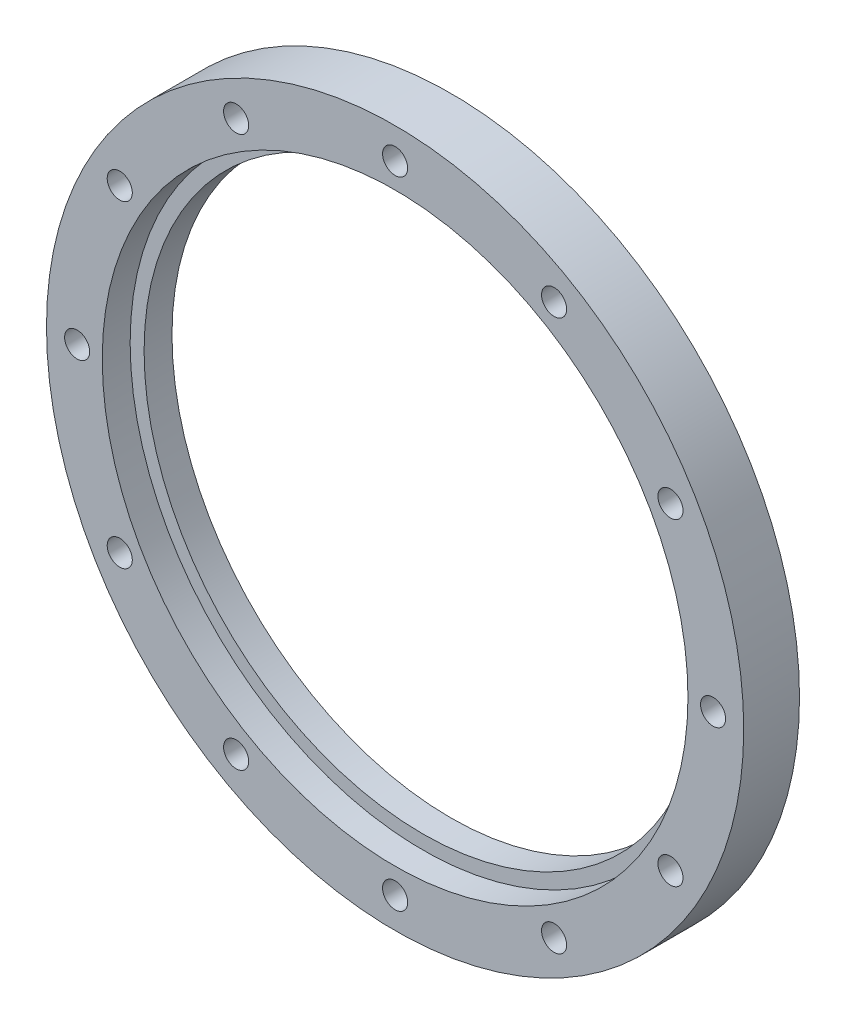
ISO-10303-21;
HEADER;
FILE_DESCRIPTION(('STEP AP214'),'2;1');
FILE_NAME('part.step','',(''),(''),'','','');
FILE_SCHEMA(('AUTOMOTIVE_DESIGN { 1 0 10303 214 1 1 1 1 }'));
ENDSEC;
DATA;
#1=APPLICATION_CONTEXT('core data for automotive mechanical design processes');
#2=APPLICATION_PROTOCOL_DEFINITION('international standard','automotive_design',2000,#1);
#3=PRODUCT_CONTEXT('',#1,'mechanical');
#4=PRODUCT('Part','Part','',(#3));
#5=PRODUCT_RELATED_PRODUCT_CATEGORY('part','',(#4));
#6=PRODUCT_DEFINITION_FORMATION('','',#4);
#7=PRODUCT_DEFINITION_CONTEXT('part definition',#1,'design');
#8=PRODUCT_DEFINITION('design','',#6,#7);
#9=PRODUCT_DEFINITION_SHAPE('','',#8);
#10=(LENGTH_UNIT() NAMED_UNIT(*) SI_UNIT(.MILLI.,.METRE.));
#11=(NAMED_UNIT(*) PLANE_ANGLE_UNIT() SI_UNIT($,.RADIAN.));
#12=(NAMED_UNIT(*) SI_UNIT($,.STERADIAN.) SOLID_ANGLE_UNIT());
#13=UNCERTAINTY_MEASURE_WITH_UNIT(LENGTH_MEASURE(1.E-05),#10,'distance_accuracy_value','');
#14=(GEOMETRIC_REPRESENTATION_CONTEXT(3) GLOBAL_UNCERTAINTY_ASSIGNED_CONTEXT((#13)) GLOBAL_UNIT_ASSIGNED_CONTEXT((#10,
#11,#12)) REPRESENTATION_CONTEXT('',''));
#15=CARTESIAN_POINT('',(0.,0.,0.));
#16=DIRECTION('',(0.,0.,1.));
#17=DIRECTION('',(1.,0.,0.));
#18=AXIS2_PLACEMENT_3D('',#15,#16,#17);
#19=CARTESIAN_POINT('',(0.,0.,0.));
#20=DIRECTION('',(0.,0.,1.));
#21=DIRECTION('',(1.,0.,0.));
#22=AXIS2_PLACEMENT_3D('',#19,#20,#21);
#23=PLANE('',#22);
#24=CARTESIAN_POINT('',(49.3634480157127,28.5000000000006,0.));
#25=DIRECTION('',(0.,0.,-1.));
#26=DIRECTION('',(-1.,0.,0.));
#27=AXIS2_PLACEMENT_3D('',#24,#25,#26);
#28=CIRCLE('',#27,5.);
#29=CARTESIAN_POINT('',(44.3634480157127,28.5000000000006,0.));
#30=VERTEX_POINT('',#29);
#31=EDGE_CURVE('E185',#30,#30,#28,.T.);
#32=ORIENTED_EDGE('',*,*,#31,.F.);
#33=EDGE_LOOP('',(#32));
#34=FACE_BOUND('',#33,.T.);
#35=CARTESIAN_POINT('',(57.,5.97043308942176E-13,0.));
#36=DIRECTION('',(0.,0.,-1.));
#37=DIRECTION('',(-1.,0.,0.));
#38=AXIS2_PLACEMENT_3D('',#35,#36,#37);
#39=CIRCLE('',#38,5.);
#40=CARTESIAN_POINT('',(52.,5.97043308942176E-13,0.));
#41=VERTEX_POINT('',#40);
#42=EDGE_CURVE('E173',#41,#41,#39,.T.);
#43=ORIENTED_EDGE('',*,*,#42,.F.);
#44=EDGE_LOOP('',(#43));
#45=FACE_BOUND('',#44,.T.);
#46=CARTESIAN_POINT('',(49.3634480157133,-28.4999999999995,0.));
#47=DIRECTION('',(0.,0.,-1.));
#48=DIRECTION('',(-1.,0.,0.));
#49=AXIS2_PLACEMENT_3D('',#46,#47,#48);
#50=CIRCLE('',#49,5.);
#51=CARTESIAN_POINT('',(44.3634480157133,-28.4999999999995,0.));
#52=VERTEX_POINT('',#51);
#53=EDGE_CURVE('E161',#52,#52,#50,.T.);
#54=ORIENTED_EDGE('',*,*,#53,.F.);
#55=EDGE_LOOP('',(#54));
#56=FACE_BOUND('',#55,.T.);
#57=CARTESIAN_POINT('',(28.5000000000004,-49.3634480157128,0.));
#58=DIRECTION('',(0.,0.,-1.));
#59=DIRECTION('',(-1.,0.,0.));
#60=AXIS2_PLACEMENT_3D('',#57,#58,#59);
#61=CIRCLE('',#60,5.);
#62=CARTESIAN_POINT('',(23.5000000000004,-49.3634480157128,0.));
#63=VERTEX_POINT('',#62);
#64=EDGE_CURVE('E149',#63,#63,#61,.T.);
#65=ORIENTED_EDGE('',*,*,#64,.F.);
#66=EDGE_LOOP('',(#65));
#67=FACE_BOUND('',#66,.T.);
#68=CARTESIAN_POINT('',(-28.4999999999997,-49.3634480157132,0.));
#69=DIRECTION('',(0.,0.,-1.));
#70=DIRECTION('',(-1.,0.,0.));
#71=AXIS2_PLACEMENT_3D('',#68,#69,#70);
#72=CIRCLE('',#71,5.);
#73=CARTESIAN_POINT('',(-33.4999999999997,-49.3634480157132,0.));
#74=VERTEX_POINT('',#73);
#75=EDGE_CURVE('E125',#74,#74,#72,.T.);
#76=ORIENTED_EDGE('',*,*,#75,.F.);
#77=EDGE_LOOP('',(#76));
#78=FACE_BOUND('',#77,.T.);
#79=CARTESIAN_POINT('',(-49.3634480157129,-28.5000000000002,0.));
#80=DIRECTION('',(0.,0.,-1.));
#81=DIRECTION('',(-1.,0.,0.));
#82=AXIS2_PLACEMENT_3D('',#79,#80,#81);
#83=CIRCLE('',#82,5.);
#84=CARTESIAN_POINT('',(-54.3634480157129,-28.5000000000002,0.));
#85=VERTEX_POINT('',#84);
#86=EDGE_CURVE('E113',#85,#85,#83,.T.);
#87=ORIENTED_EDGE('',*,*,#86,.F.);
#88=EDGE_LOOP('',(#87));
#89=FACE_BOUND('',#88,.T.);
#90=CARTESIAN_POINT('',(-57.,-1.99014436314059E-13,0.));
#91=DIRECTION('',(0.,0.,-1.));
#92=DIRECTION('',(-1.,0.,0.));
#93=AXIS2_PLACEMENT_3D('',#90,#91,#92);
#94=CIRCLE('',#93,5.);
#95=CARTESIAN_POINT('',(-62.,-1.99014436314059E-13,0.));
#96=VERTEX_POINT('',#95);
#97=EDGE_CURVE('E101',#96,#96,#94,.T.);
#98=ORIENTED_EDGE('',*,*,#97,.F.);
#99=EDGE_LOOP('',(#98));
#100=FACE_BOUND('',#99,.T.);
#101=CARTESIAN_POINT('',(-49.3634480157131,28.4999999999999,0.));
#102=DIRECTION('',(0.,0.,-1.));
#103=DIRECTION('',(-1.,0.,0.));
#104=AXIS2_PLACEMENT_3D('',#101,#102,#103);
#105=CIRCLE('',#104,5.);
#106=CARTESIAN_POINT('',(-54.3634480157131,28.4999999999999,0.));
#107=VERTEX_POINT('',#106);
#108=EDGE_CURVE('E89',#107,#107,#105,.T.);
#109=ORIENTED_EDGE('',*,*,#108,.F.);
#110=EDGE_LOOP('',(#109));
#111=FACE_BOUND('',#110,.T.);
#112=CARTESIAN_POINT('',(-28.5000000000001,49.363448015713,0.));
#113=DIRECTION('',(0.,0.,-1.));
#114=DIRECTION('',(-1.,0.,0.));
#115=AXIS2_PLACEMENT_3D('',#112,#113,#114);
#116=CIRCLE('',#115,5.);
#117=CARTESIAN_POINT('',(-33.5000000000001,49.363448015713,0.));
#118=VERTEX_POINT('',#117);
#119=EDGE_CURVE('E77',#118,#118,#116,.T.);
#120=ORIENTED_EDGE('',*,*,#119,.F.);
#121=EDGE_LOOP('',(#120));
#122=FACE_BOUND('',#121,.T.);
#123=CARTESIAN_POINT('',(0.,57.,0.));
#124=DIRECTION('',(0.,0.,-1.));
#125=DIRECTION('',(-1.,0.,0.));
#126=AXIS2_PLACEMENT_3D('',#123,#124,#125);
#127=CIRCLE('',#126,5.);
#128=CARTESIAN_POINT('',(-5.,57.,0.));
#129=VERTEX_POINT('',#128);
#130=EDGE_CURVE('E65',#129,#129,#127,.T.);
#131=ORIENTED_EDGE('',*,*,#130,.F.);
#132=EDGE_LOOP('',(#131));
#133=FACE_BOUND('',#132,.T.);
#134=CARTESIAN_POINT('',(0.,0.,0.));
#135=DIRECTION('',(0.,0.,1.));
#136=DIRECTION('',(1.,0.,0.));
#137=AXIS2_PLACEMENT_3D('',#134,#135,#136);
#138=CIRCLE('',#137,50.);
#139=CARTESIAN_POINT('',(50.,0.,0.));
#140=VERTEX_POINT('',#139);
#141=EDGE_CURVE('E46',#140,#140,#138,.T.);
#142=ORIENTED_EDGE('',*,*,#141,.T.);
#143=EDGE_LOOP('',(#142));
#144=FACE_BOUND('',#143,.T.);
#145=CARTESIAN_POINT('',(0.,0.,0.));
#146=DIRECTION('',(0.,0.,1.));
#147=DIRECTION('',(1.,0.,0.));
#148=AXIS2_PLACEMENT_3D('',#145,#146,#147);
#149=CIRCLE('',#148,62.5);
#150=CARTESIAN_POINT('',(62.5,0.,0.));
#151=VERTEX_POINT('',#150);
#152=EDGE_CURVE('E41',#151,#151,#149,.T.);
#153=ORIENTED_EDGE('',*,*,#152,.F.);
#154=EDGE_LOOP('',(#153));
#155=FACE_BOUND('',#154,.T.);
#156=CARTESIAN_POINT('',(0.,-57.,0.));
#157=DIRECTION('',(0.,0.,-1.));
#158=DIRECTION('',(-1.,0.,0.));
#159=AXIS2_PLACEMENT_3D('',#156,#157,#158);
#160=CIRCLE('',#159,5.);
#161=CARTESIAN_POINT('',(-5.,-57.,0.));
#162=VERTEX_POINT('',#161);
#163=EDGE_CURVE('E137',#162,#162,#160,.T.);
#164=ORIENTED_EDGE('',*,*,#163,.F.);
#165=EDGE_LOOP('',(#164));
#166=FACE_BOUND('',#165,.T.);
#167=CARTESIAN_POINT('',(28.4999999999994,49.3634480157134,0.));
#168=DIRECTION('',(0.,0.,-1.));
#169=DIRECTION('',(-1.,0.,0.));
#170=AXIS2_PLACEMENT_3D('',#167,#168,#169);
#171=CIRCLE('',#170,5.);
#172=CARTESIAN_POINT('',(23.4999999999994,49.3634480157134,0.));
#173=VERTEX_POINT('',#172);
#174=EDGE_CURVE('E197',#173,#173,#171,.T.);
#175=ORIENTED_EDGE('',*,*,#174,.F.);
#176=EDGE_LOOP('',(#175));
#177=FACE_BOUND('',#176,.T.);
#178=ADVANCED_FACE('F33',(#34,#45,#56,#67,#78,#89,#100,#111,#122,#133,#144,#155,#166,#177),#23,.F.);
#179=CARTESIAN_POINT('',(0.,0.,10.));
#180=DIRECTION('',(0.,0.,1.));
#181=DIRECTION('',(1.,0.,0.));
#182=AXIS2_PLACEMENT_3D('',#179,#180,#181);
#183=PLANE('',#182);
#184=CARTESIAN_POINT('',(28.4999999999994,49.3634480157134,10.));
#185=DIRECTION('',(0.,0.,-1.));
#186=DIRECTION('',(-1.,0.,0.));
#187=AXIS2_PLACEMENT_3D('',#184,#185,#186);
#188=CIRCLE('',#187,2.25);
#189=CARTESIAN_POINT('',(26.2499999999994,49.3634480157134,10.));
#190=VERTEX_POINT('',#189);
#191=EDGE_CURVE('E188',#190,#190,#188,.T.);
#192=ORIENTED_EDGE('',*,*,#191,.T.);
#193=EDGE_LOOP('',(#192));
#194=FACE_BOUND('',#193,.T.);
#195=CARTESIAN_POINT('',(49.3634480157127,28.5000000000006,10.));
#196=DIRECTION('',(0.,0.,-1.));
#197=DIRECTION('',(-1.,0.,0.));
#198=AXIS2_PLACEMENT_3D('',#195,#196,#197);
#199=CIRCLE('',#198,2.25);
#200=CARTESIAN_POINT('',(47.1134480157127,28.5000000000006,10.));
#201=VERTEX_POINT('',#200);
#202=EDGE_CURVE('E176',#201,#201,#199,.T.);
#203=ORIENTED_EDGE('',*,*,#202,.T.);
#204=EDGE_LOOP('',(#203));
#205=FACE_BOUND('',#204,.T.);
#206=CARTESIAN_POINT('',(57.,5.97043308942176E-13,10.));
#207=DIRECTION('',(0.,0.,-1.));
#208=DIRECTION('',(-1.,0.,0.));
#209=AXIS2_PLACEMENT_3D('',#206,#207,#208);
#210=CIRCLE('',#209,2.25);
#211=CARTESIAN_POINT('',(54.75,5.97043308942176E-13,10.));
#212=VERTEX_POINT('',#211);
#213=EDGE_CURVE('E164',#212,#212,#210,.T.);
#214=ORIENTED_EDGE('',*,*,#213,.T.);
#215=EDGE_LOOP('',(#214));
#216=FACE_BOUND('',#215,.T.);
#217=CARTESIAN_POINT('',(49.3634480157133,-28.4999999999995,10.));
#218=DIRECTION('',(0.,0.,-1.));
#219=DIRECTION('',(-1.,0.,0.));
#220=AXIS2_PLACEMENT_3D('',#217,#218,#219);
#221=CIRCLE('',#220,2.25);
#222=CARTESIAN_POINT('',(47.1134480157133,-28.4999999999995,10.));
#223=VERTEX_POINT('',#222);
#224=EDGE_CURVE('E152',#223,#223,#221,.T.);
#225=ORIENTED_EDGE('',*,*,#224,.T.);
#226=EDGE_LOOP('',(#225));
#227=FACE_BOUND('',#226,.T.);
#228=CARTESIAN_POINT('',(28.5000000000004,-49.3634480157128,10.));
#229=DIRECTION('',(0.,0.,-1.));
#230=DIRECTION('',(-1.,0.,0.));
#231=AXIS2_PLACEMENT_3D('',#228,#229,#230);
#232=CIRCLE('',#231,2.25);
#233=CARTESIAN_POINT('',(26.2500000000004,-49.3634480157128,10.));
#234=VERTEX_POINT('',#233);
#235=EDGE_CURVE('E140',#234,#234,#232,.T.);
#236=ORIENTED_EDGE('',*,*,#235,.T.);
#237=EDGE_LOOP('',(#236));
#238=FACE_BOUND('',#237,.T.);
#239=CARTESIAN_POINT('',(0.,0.,10.));
#240=DIRECTION('',(0.,0.,1.));
#241=DIRECTION('',(1.,0.,0.));
#242=AXIS2_PLACEMENT_3D('',#239,#240,#241);
#243=CIRCLE('',#242,62.5);
#244=CARTESIAN_POINT('',(62.5,0.,10.));
#245=VERTEX_POINT('',#244);
#246=EDGE_CURVE('E10',#245,#245,#243,.T.);
#247=ORIENTED_EDGE('',*,*,#246,.T.);
#248=EDGE_LOOP('',(#247));
#249=FACE_BOUND('',#248,.T.);
#250=CARTESIAN_POINT('',(0.,0.,10.));
#251=DIRECTION('',(0.,0.,1.));
#252=DIRECTION('',(1.,0.,0.));
#253=AXIS2_PLACEMENT_3D('',#250,#251,#252);
#254=CIRCLE('',#253,52.5);
#255=CARTESIAN_POINT('',(52.5,0.,10.));
#256=VERTEX_POINT('',#255);
#257=EDGE_CURVE('E50',#256,#256,#254,.T.);
#258=ORIENTED_EDGE('',*,*,#257,.F.);
#259=EDGE_LOOP('',(#258));
#260=FACE_BOUND('',#259,.T.);
#261=CARTESIAN_POINT('',(0.,57.,10.));
#262=DIRECTION('',(0.,0.,-1.));
#263=DIRECTION('',(-1.,0.,0.));
#264=AXIS2_PLACEMENT_3D('',#261,#262,#263);
#265=CIRCLE('',#264,2.25);
#266=CARTESIAN_POINT('',(-2.25,57.,10.));
#267=VERTEX_POINT('',#266);
#268=EDGE_CURVE('E54',#267,#267,#265,.T.);
#269=ORIENTED_EDGE('',*,*,#268,.T.);
#270=EDGE_LOOP('',(#269));
#271=FACE_BOUND('',#270,.T.);
#272=CARTESIAN_POINT('',(-28.5000000000001,49.363448015713,10.));
#273=DIRECTION('',(0.,0.,-1.));
#274=DIRECTION('',(-1.,0.,0.));
#275=AXIS2_PLACEMENT_3D('',#272,#273,#274);
#276=CIRCLE('',#275,2.25);
#277=CARTESIAN_POINT('',(-30.7500000000001,49.363448015713,10.));
#278=VERTEX_POINT('',#277);
#279=EDGE_CURVE('E68',#278,#278,#276,.T.);
#280=ORIENTED_EDGE('',*,*,#279,.T.);
#281=EDGE_LOOP('',(#280));
#282=FACE_BOUND('',#281,.T.);
#283=CARTESIAN_POINT('',(-49.3634480157131,28.4999999999999,10.));
#284=DIRECTION('',(0.,0.,-1.));
#285=DIRECTION('',(-1.,0.,0.));
#286=AXIS2_PLACEMENT_3D('',#283,#284,#285);
#287=CIRCLE('',#286,2.25);
#288=CARTESIAN_POINT('',(-51.6134480157131,28.4999999999999,10.));
#289=VERTEX_POINT('',#288);
#290=EDGE_CURVE('E80',#289,#289,#287,.T.);
#291=ORIENTED_EDGE('',*,*,#290,.T.);
#292=EDGE_LOOP('',(#291));
#293=FACE_BOUND('',#292,.T.);
#294=CARTESIAN_POINT('',(-57.,-1.99014436314059E-13,10.));
#295=DIRECTION('',(0.,0.,-1.));
#296=DIRECTION('',(-1.,0.,0.));
#297=AXIS2_PLACEMENT_3D('',#294,#295,#296);
#298=CIRCLE('',#297,2.25);
#299=CARTESIAN_POINT('',(-59.25,-1.99014436314059E-13,10.));
#300=VERTEX_POINT('',#299);
#301=EDGE_CURVE('E92',#300,#300,#298,.T.);
#302=ORIENTED_EDGE('',*,*,#301,.T.);
#303=EDGE_LOOP('',(#302));
#304=FACE_BOUND('',#303,.T.);
#305=CARTESIAN_POINT('',(-49.3634480157129,-28.5000000000002,10.));
#306=DIRECTION('',(0.,0.,-1.));
#307=DIRECTION('',(-1.,0.,0.));
#308=AXIS2_PLACEMENT_3D('',#305,#306,#307);
#309=CIRCLE('',#308,2.25);
#310=CARTESIAN_POINT('',(-51.6134480157129,-28.5000000000002,10.));
#311=VERTEX_POINT('',#310);
#312=EDGE_CURVE('E104',#311,#311,#309,.T.);
#313=ORIENTED_EDGE('',*,*,#312,.T.);
#314=EDGE_LOOP('',(#313));
#315=FACE_BOUND('',#314,.T.);
#316=CARTESIAN_POINT('',(-28.4999999999997,-49.3634480157132,10.));
#317=DIRECTION('',(0.,0.,-1.));
#318=DIRECTION('',(-1.,0.,0.));
#319=AXIS2_PLACEMENT_3D('',#316,#317,#318);
#320=CIRCLE('',#319,2.25);
#321=CARTESIAN_POINT('',(-30.7499999999997,-49.3634480157132,10.));
#322=VERTEX_POINT('',#321);
#323=EDGE_CURVE('E116',#322,#322,#320,.T.);
#324=ORIENTED_EDGE('',*,*,#323,.T.);
#325=EDGE_LOOP('',(#324));
#326=FACE_BOUND('',#325,.T.);
#327=CARTESIAN_POINT('',(0.,-57.,10.));
#328=DIRECTION('',(0.,0.,-1.));
#329=DIRECTION('',(-1.,0.,0.));
#330=AXIS2_PLACEMENT_3D('',#327,#328,#329);
#331=CIRCLE('',#330,2.25);
#332=CARTESIAN_POINT('',(-2.25,-57.,10.));
#333=VERTEX_POINT('',#332);
#334=EDGE_CURVE('E128',#333,#333,#331,.T.);
#335=ORIENTED_EDGE('',*,*,#334,.T.);
#336=EDGE_LOOP('',(#335));
#337=FACE_BOUND('',#336,.T.);
#338=ADVANCED_FACE('F204',(#194,#205,#216,#227,#238,#249,#260,#271,#282,#293,#304,#315,#326,
#337),#183,.T.);
#339=CARTESIAN_POINT('',(0.,0.,0.));
#340=DIRECTION('',(0.,0.,1.));
#341=DIRECTION('',(1.,0.,0.));
#342=AXIS2_PLACEMENT_3D('',#339,#340,#341);
#343=CYLINDRICAL_SURFACE('',#342,50.);
#344=ORIENTED_EDGE('',*,*,#141,.F.);
#345=EDGE_LOOP('',(#344));
#346=FACE_BOUND('',#345,.T.);
#347=CARTESIAN_POINT('',(0.,0.,5.));
#348=DIRECTION('',(0.,0.,1.));
#349=DIRECTION('',(1.,0.,0.));
#350=AXIS2_PLACEMENT_3D('',#347,#348,#349);
#351=CIRCLE('',#350,50.);
#352=CARTESIAN_POINT('',(50.,0.,5.));
#353=VERTEX_POINT('',#352);
#354=EDGE_CURVE('E37',#353,#353,#351,.F.);
#355=ORIENTED_EDGE('',*,*,#354,.F.);
#356=EDGE_LOOP('',(#355));
#357=FACE_BOUND('',#356,.T.);
#358=ADVANCED_FACE('F209',(#346,#357),#343,.F.);
#359=CARTESIAN_POINT('',(0.,0.,10.));
#360=DIRECTION('',(0.,0.,-1.));
#361=DIRECTION('',(-1.,0.,0.));
#362=AXIS2_PLACEMENT_3D('',#359,#360,#361);
#363=CYLINDRICAL_SURFACE('',#362,62.5);
#364=ORIENTED_EDGE('',*,*,#246,.F.);
#365=EDGE_LOOP('',(#364));
#366=FACE_BOUND('',#365,.T.);
#367=ORIENTED_EDGE('',*,*,#152,.T.);
#368=EDGE_LOOP('',(#367));
#369=FACE_BOUND('',#368,.T.);
#370=ADVANCED_FACE('F35',(#366,#369),#363,.T.);
#371=CARTESIAN_POINT('',(0.,0.,5.));
#372=DIRECTION('',(0.,0.,1.));
#373=DIRECTION('',(1.,0.,0.));
#374=AXIS2_PLACEMENT_3D('',#371,#372,#373);
#375=PLANE('',#374);
#376=CARTESIAN_POINT('',(0.,0.,5.));
#377=DIRECTION('',(0.,0.,1.));
#378=DIRECTION('',(1.,0.,0.));
#379=AXIS2_PLACEMENT_3D('',#376,#377,#378);
#380=CIRCLE('',#379,52.5);
#381=CARTESIAN_POINT('',(52.5,0.,5.));
#382=VERTEX_POINT('',#381);
#383=EDGE_CURVE('E53',#382,#382,#380,.T.);
#384=ORIENTED_EDGE('',*,*,#383,.T.);
#385=EDGE_LOOP('',(#384));
#386=FACE_BOUND('',#385,.T.);
#387=ORIENTED_EDGE('',*,*,#354,.T.);
#388=EDGE_LOOP('',(#387));
#389=FACE_BOUND('',#388,.T.);
#390=ADVANCED_FACE('F222',(#386,#389),#375,.T.);
#391=CARTESIAN_POINT('',(0.,0.,5.));
#392=DIRECTION('',(0.,0.,1.));
#393=DIRECTION('',(1.,0.,0.));
#394=AXIS2_PLACEMENT_3D('',#391,#392,#393);
#395=CYLINDRICAL_SURFACE('',#394,52.5);
#396=ORIENTED_EDGE('',*,*,#383,.F.);
#397=EDGE_LOOP('',(#396));
#398=FACE_BOUND('',#397,.T.);
#399=ORIENTED_EDGE('',*,*,#257,.T.);
#400=EDGE_LOOP('',(#399));
#401=FACE_BOUND('',#400,.T.);
#402=ADVANCED_FACE('F218',(#398,#401),#395,.F.);
#403=CARTESIAN_POINT('',(0.,57.,0.));
#404=DIRECTION('',(0.,0.,-1.));
#405=DIRECTION('',(-1.,0.,0.));
#406=AXIS2_PLACEMENT_3D('',#403,#404,#405);
#407=CYLINDRICAL_SURFACE('',#406,2.25);
#408=ORIENTED_EDGE('',*,*,#268,.F.);
#409=EDGE_LOOP('',(#408));
#410=FACE_BOUND('',#409,.T.);
#411=CARTESIAN_POINT('',(0.,57.,3.));
#412=DIRECTION('',(0.,0.,-1.));
#413=DIRECTION('',(-1.,0.,0.));
#414=AXIS2_PLACEMENT_3D('',#411,#412,#413);
#415=CIRCLE('',#414,2.25);
#416=CARTESIAN_POINT('',(-2.25,57.,3.));
#417=VERTEX_POINT('',#416);
#418=EDGE_CURVE('E59',#417,#417,#415,.T.);
#419=ORIENTED_EDGE('',*,*,#418,.T.);
#420=EDGE_LOOP('',(#419));
#421=FACE_BOUND('',#420,.T.);
#422=ADVANCED_FACE('F221',(#410,#421),#407,.F.);
#423=CARTESIAN_POINT('',(2.25,57.,3.));
#424=DIRECTION('',(0.,0.,1.));
#425=DIRECTION('',(1.,0.,0.));
#426=AXIS2_PLACEMENT_3D('',#423,#424,#425);
#427=PLANE('',#426);
#428=ORIENTED_EDGE('',*,*,#418,.F.);
#429=EDGE_LOOP('',(#428));
#430=FACE_BOUND('',#429,.T.);
#431=CARTESIAN_POINT('',(0.,57.,3.));
#432=DIRECTION('',(0.,0.,-1.));
#433=DIRECTION('',(-1.,0.,0.));
#434=AXIS2_PLACEMENT_3D('',#431,#432,#433);
#435=CIRCLE('',#434,5.);
#436=CARTESIAN_POINT('',(-5.,57.,3.));
#437=VERTEX_POINT('',#436);
#438=EDGE_CURVE('E62',#437,#437,#435,.T.);
#439=ORIENTED_EDGE('',*,*,#438,.T.);
#440=EDGE_LOOP('',(#439));
#441=FACE_BOUND('',#440,.T.);
#442=ADVANCED_FACE('F229',(#430,#441),#427,.F.);
#443=CARTESIAN_POINT('',(0.,57.,0.));
#444=DIRECTION('',(0.,0.,-1.));
#445=DIRECTION('',(-1.,0.,0.));
#446=AXIS2_PLACEMENT_3D('',#443,#444,#445);
#447=CYLINDRICAL_SURFACE('',#446,5.);
#448=ORIENTED_EDGE('',*,*,#438,.F.);
#449=EDGE_LOOP('',(#448));
#450=FACE_BOUND('',#449,.T.);
#451=ORIENTED_EDGE('',*,*,#130,.T.);
#452=EDGE_LOOP('',(#451));
#453=FACE_BOUND('',#452,.T.);
#454=ADVANCED_FACE('F233',(#450,#453),#447,.F.);
#455=CARTESIAN_POINT('',(-28.5000000000001,49.363448015713,0.));
#456=DIRECTION('',(0.,0.,-1.));
#457=DIRECTION('',(-1.,0.,0.));
#458=AXIS2_PLACEMENT_3D('',#455,#456,#457);
#459=CYLINDRICAL_SURFACE('',#458,2.25);
#460=ORIENTED_EDGE('',*,*,#279,.F.);
#461=EDGE_LOOP('',(#460));
#462=FACE_BOUND('',#461,.T.);
#463=CARTESIAN_POINT('',(-28.5000000000001,49.363448015713,3.));
#464=DIRECTION('',(0.,0.,-1.));
#465=DIRECTION('',(-1.,0.,0.));
#466=AXIS2_PLACEMENT_3D('',#463,#464,#465);
#467=CIRCLE('',#466,2.25);
#468=CARTESIAN_POINT('',(-30.7500000000001,49.363448015713,3.));
#469=VERTEX_POINT('',#468);
#470=EDGE_CURVE('E71',#469,#469,#467,.T.);
#471=ORIENTED_EDGE('',*,*,#470,.T.);
#472=EDGE_LOOP('',(#471));
#473=FACE_BOUND('',#472,.T.);
#474=ADVANCED_FACE('F237',(#462,#473),#459,.F.);
#475=CARTESIAN_POINT('',(-26.2500000000001,49.363448015713,3.));
#476=DIRECTION('',(0.,0.,1.));
#477=DIRECTION('',(1.,0.,0.));
#478=AXIS2_PLACEMENT_3D('',#475,#476,#477);
#479=PLANE('',#478);
#480=ORIENTED_EDGE('',*,*,#470,.F.);
#481=EDGE_LOOP('',(#480));
#482=FACE_BOUND('',#481,.T.);
#483=CARTESIAN_POINT('',(-28.5000000000001,49.363448015713,3.));
#484=DIRECTION('',(0.,0.,-1.));
#485=DIRECTION('',(-1.,0.,0.));
#486=AXIS2_PLACEMENT_3D('',#483,#484,#485);
#487=CIRCLE('',#486,5.);
#488=CARTESIAN_POINT('',(-33.5000000000001,49.363448015713,3.));
#489=VERTEX_POINT('',#488);
#490=EDGE_CURVE('E74',#489,#489,#487,.T.);
#491=ORIENTED_EDGE('',*,*,#490,.T.);
#492=EDGE_LOOP('',(#491));
#493=FACE_BOUND('',#492,.T.);
#494=ADVANCED_FACE('F241',(#482,#493),#479,.F.);
#495=CARTESIAN_POINT('',(-28.5000000000001,49.363448015713,0.));
#496=DIRECTION('',(0.,0.,-1.));
#497=DIRECTION('',(-1.,0.,0.));
#498=AXIS2_PLACEMENT_3D('',#495,#496,#497);
#499=CYLINDRICAL_SURFACE('',#498,5.);
#500=ORIENTED_EDGE('',*,*,#490,.F.);
#501=EDGE_LOOP('',(#500));
#502=FACE_BOUND('',#501,.T.);
#503=ORIENTED_EDGE('',*,*,#119,.T.);
#504=EDGE_LOOP('',(#503));
#505=FACE_BOUND('',#504,.T.);
#506=ADVANCED_FACE('F245',(#502,#505),#499,.F.);
#507=CARTESIAN_POINT('',(-49.3634480157131,28.4999999999999,0.));
#508=DIRECTION('',(0.,0.,-1.));
#509=DIRECTION('',(-1.,0.,0.));
#510=AXIS2_PLACEMENT_3D('',#507,#508,#509);
#511=CYLINDRICAL_SURFACE('',#510,2.25);
#512=ORIENTED_EDGE('',*,*,#290,.F.);
#513=EDGE_LOOP('',(#512));
#514=FACE_BOUND('',#513,.T.);
#515=CARTESIAN_POINT('',(-49.3634480157131,28.4999999999999,3.));
#516=DIRECTION('',(0.,0.,-1.));
#517=DIRECTION('',(-1.,0.,0.));
#518=AXIS2_PLACEMENT_3D('',#515,#516,#517);
#519=CIRCLE('',#518,2.25);
#520=CARTESIAN_POINT('',(-51.6134480157131,28.4999999999999,3.));
#521=VERTEX_POINT('',#520);
#522=EDGE_CURVE('E83',#521,#521,#519,.T.);
#523=ORIENTED_EDGE('',*,*,#522,.T.);
#524=EDGE_LOOP('',(#523));
#525=FACE_BOUND('',#524,.T.);
#526=ADVANCED_FACE('F249',(#514,#525),#511,.F.);
#527=CARTESIAN_POINT('',(-47.1134480157131,28.4999999999999,3.));
#528=DIRECTION('',(0.,0.,1.));
#529=DIRECTION('',(1.,0.,0.));
#530=AXIS2_PLACEMENT_3D('',#527,#528,#529);
#531=PLANE('',#530);
#532=ORIENTED_EDGE('',*,*,#522,.F.);
#533=EDGE_LOOP('',(#532));
#534=FACE_BOUND('',#533,.T.);
#535=CARTESIAN_POINT('',(-49.3634480157131,28.4999999999999,3.));
#536=DIRECTION('',(0.,0.,-1.));
#537=DIRECTION('',(-1.,0.,0.));
#538=AXIS2_PLACEMENT_3D('',#535,#536,#537);
#539=CIRCLE('',#538,5.);
#540=CARTESIAN_POINT('',(-54.3634480157131,28.4999999999999,3.));
#541=VERTEX_POINT('',#540);
#542=EDGE_CURVE('E86',#541,#541,#539,.T.);
#543=ORIENTED_EDGE('',*,*,#542,.T.);
#544=EDGE_LOOP('',(#543));
#545=FACE_BOUND('',#544,.T.);
#546=ADVANCED_FACE('F253',(#534,#545),#531,.F.);
#547=CARTESIAN_POINT('',(-49.3634480157131,28.4999999999999,0.));
#548=DIRECTION('',(0.,0.,-1.));
#549=DIRECTION('',(-1.,0.,0.));
#550=AXIS2_PLACEMENT_3D('',#547,#548,#549);
#551=CYLINDRICAL_SURFACE('',#550,5.);
#552=ORIENTED_EDGE('',*,*,#542,.F.);
#553=EDGE_LOOP('',(#552));
#554=FACE_BOUND('',#553,.T.);
#555=ORIENTED_EDGE('',*,*,#108,.T.);
#556=EDGE_LOOP('',(#555));
#557=FACE_BOUND('',#556,.T.);
#558=ADVANCED_FACE('F257',(#554,#557),#551,.F.);
#559=CARTESIAN_POINT('',(-57.,-1.99014436314059E-13,0.));
#560=DIRECTION('',(0.,0.,-1.));
#561=DIRECTION('',(-1.,0.,0.));
#562=AXIS2_PLACEMENT_3D('',#559,#560,#561);
#563=CYLINDRICAL_SURFACE('',#562,2.25);
#564=ORIENTED_EDGE('',*,*,#301,.F.);
#565=EDGE_LOOP('',(#564));
#566=FACE_BOUND('',#565,.T.);
#567=CARTESIAN_POINT('',(-57.,-1.99014436314059E-13,3.));
#568=DIRECTION('',(0.,0.,-1.));
#569=DIRECTION('',(-1.,0.,0.));
#570=AXIS2_PLACEMENT_3D('',#567,#568,#569);
#571=CIRCLE('',#570,2.25);
#572=CARTESIAN_POINT('',(-59.25,-1.99014436314059E-13,3.));
#573=VERTEX_POINT('',#572);
#574=EDGE_CURVE('E95',#573,#573,#571,.T.);
#575=ORIENTED_EDGE('',*,*,#574,.T.);
#576=EDGE_LOOP('',(#575));
#577=FACE_BOUND('',#576,.T.);
#578=ADVANCED_FACE('F261',(#566,#577),#563,.F.);
#579=CARTESIAN_POINT('',(-54.75,-1.99014436314059E-13,3.));
#580=DIRECTION('',(0.,0.,1.));
#581=DIRECTION('',(1.,0.,0.));
#582=AXIS2_PLACEMENT_3D('',#579,#580,#581);
#583=PLANE('',#582);
#584=ORIENTED_EDGE('',*,*,#574,.F.);
#585=EDGE_LOOP('',(#584));
#586=FACE_BOUND('',#585,.T.);
#587=CARTESIAN_POINT('',(-57.,-1.99014436314059E-13,3.));
#588=DIRECTION('',(0.,0.,-1.));
#589=DIRECTION('',(-1.,0.,0.));
#590=AXIS2_PLACEMENT_3D('',#587,#588,#589);
#591=CIRCLE('',#590,5.);
#592=CARTESIAN_POINT('',(-62.,-1.99014436314059E-13,3.));
#593=VERTEX_POINT('',#592);
#594=EDGE_CURVE('E98',#593,#593,#591,.T.);
#595=ORIENTED_EDGE('',*,*,#594,.T.);
#596=EDGE_LOOP('',(#595));
#597=FACE_BOUND('',#596,.T.);
#598=ADVANCED_FACE('F265',(#586,#597),#583,.F.);
#599=CARTESIAN_POINT('',(-57.,-1.99014436314059E-13,0.));
#600=DIRECTION('',(0.,0.,-1.));
#601=DIRECTION('',(-1.,0.,0.));
#602=AXIS2_PLACEMENT_3D('',#599,#600,#601);
#603=CYLINDRICAL_SURFACE('',#602,5.);
#604=ORIENTED_EDGE('',*,*,#594,.F.);
#605=EDGE_LOOP('',(#604));
#606=FACE_BOUND('',#605,.T.);
#607=ORIENTED_EDGE('',*,*,#97,.T.);
#608=EDGE_LOOP('',(#607));
#609=FACE_BOUND('',#608,.T.);
#610=ADVANCED_FACE('F269',(#606,#609),#603,.F.);
#611=CARTESIAN_POINT('',(-49.3634480157129,-28.5000000000002,0.));
#612=DIRECTION('',(0.,0.,-1.));
#613=DIRECTION('',(-1.,0.,0.));
#614=AXIS2_PLACEMENT_3D('',#611,#612,#613);
#615=CYLINDRICAL_SURFACE('',#614,2.25);
#616=ORIENTED_EDGE('',*,*,#312,.F.);
#617=EDGE_LOOP('',(#616));
#618=FACE_BOUND('',#617,.T.);
#619=CARTESIAN_POINT('',(-49.3634480157129,-28.5000000000002,3.));
#620=DIRECTION('',(0.,0.,-1.));
#621=DIRECTION('',(-1.,0.,0.));
#622=AXIS2_PLACEMENT_3D('',#619,#620,#621);
#623=CIRCLE('',#622,2.25);
#624=CARTESIAN_POINT('',(-51.6134480157129,-28.5000000000002,3.));
#625=VERTEX_POINT('',#624);
#626=EDGE_CURVE('E107',#625,#625,#623,.T.);
#627=ORIENTED_EDGE('',*,*,#626,.T.);
#628=EDGE_LOOP('',(#627));
#629=FACE_BOUND('',#628,.T.);
#630=ADVANCED_FACE('F273',(#618,#629),#615,.F.);
#631=CARTESIAN_POINT('',(-47.1134480157129,-28.5000000000002,3.));
#632=DIRECTION('',(0.,0.,1.));
#633=DIRECTION('',(1.,0.,0.));
#634=AXIS2_PLACEMENT_3D('',#631,#632,#633);
#635=PLANE('',#634);
#636=ORIENTED_EDGE('',*,*,#626,.F.);
#637=EDGE_LOOP('',(#636));
#638=FACE_BOUND('',#637,.T.);
#639=CARTESIAN_POINT('',(-49.3634480157129,-28.5000000000002,3.));
#640=DIRECTION('',(0.,0.,-1.));
#641=DIRECTION('',(-1.,0.,0.));
#642=AXIS2_PLACEMENT_3D('',#639,#640,#641);
#643=CIRCLE('',#642,5.);
#644=CARTESIAN_POINT('',(-54.3634480157129,-28.5000000000002,3.));
#645=VERTEX_POINT('',#644);
#646=EDGE_CURVE('E110',#645,#645,#643,.T.);
#647=ORIENTED_EDGE('',*,*,#646,.T.);
#648=EDGE_LOOP('',(#647));
#649=FACE_BOUND('',#648,.T.);
#650=ADVANCED_FACE('F277',(#638,#649),#635,.F.);
#651=CARTESIAN_POINT('',(-49.3634480157129,-28.5000000000002,0.));
#652=DIRECTION('',(0.,0.,-1.));
#653=DIRECTION('',(-1.,0.,0.));
#654=AXIS2_PLACEMENT_3D('',#651,#652,#653);
#655=CYLINDRICAL_SURFACE('',#654,5.);
#656=ORIENTED_EDGE('',*,*,#646,.F.);
#657=EDGE_LOOP('',(#656));
#658=FACE_BOUND('',#657,.T.);
#659=ORIENTED_EDGE('',*,*,#86,.T.);
#660=EDGE_LOOP('',(#659));
#661=FACE_BOUND('',#660,.T.);
#662=ADVANCED_FACE('F281',(#658,#661),#655,.F.);
#663=CARTESIAN_POINT('',(-28.4999999999997,-49.3634480157132,0.));
#664=DIRECTION('',(0.,0.,-1.));
#665=DIRECTION('',(-1.,0.,0.));
#666=AXIS2_PLACEMENT_3D('',#663,#664,#665);
#667=CYLINDRICAL_SURFACE('',#666,2.25);
#668=ORIENTED_EDGE('',*,*,#323,.F.);
#669=EDGE_LOOP('',(#668));
#670=FACE_BOUND('',#669,.T.);
#671=CARTESIAN_POINT('',(-28.4999999999997,-49.3634480157132,3.));
#672=DIRECTION('',(0.,0.,-1.));
#673=DIRECTION('',(-1.,0.,0.));
#674=AXIS2_PLACEMENT_3D('',#671,#672,#673);
#675=CIRCLE('',#674,2.25);
#676=CARTESIAN_POINT('',(-30.7499999999997,-49.3634480157132,3.));
#677=VERTEX_POINT('',#676);
#678=EDGE_CURVE('E119',#677,#677,#675,.T.);
#679=ORIENTED_EDGE('',*,*,#678,.T.);
#680=EDGE_LOOP('',(#679));
#681=FACE_BOUND('',#680,.T.);
#682=ADVANCED_FACE('F285',(#670,#681),#667,.F.);
#683=CARTESIAN_POINT('',(-26.2499999999997,-49.3634480157132,3.));
#684=DIRECTION('',(0.,0.,1.));
#685=DIRECTION('',(1.,0.,0.));
#686=AXIS2_PLACEMENT_3D('',#683,#684,#685);
#687=PLANE('',#686);
#688=ORIENTED_EDGE('',*,*,#678,.F.);
#689=EDGE_LOOP('',(#688));
#690=FACE_BOUND('',#689,.T.);
#691=CARTESIAN_POINT('',(-28.4999999999997,-49.3634480157132,3.));
#692=DIRECTION('',(0.,0.,-1.));
#693=DIRECTION('',(-1.,0.,0.));
#694=AXIS2_PLACEMENT_3D('',#691,#692,#693);
#695=CIRCLE('',#694,5.);
#696=CARTESIAN_POINT('',(-33.4999999999997,-49.3634480157132,3.));
#697=VERTEX_POINT('',#696);
#698=EDGE_CURVE('E122',#697,#697,#695,.T.);
#699=ORIENTED_EDGE('',*,*,#698,.T.);
#700=EDGE_LOOP('',(#699));
#701=FACE_BOUND('',#700,.T.);
#702=ADVANCED_FACE('F289',(#690,#701),#687,.F.);
#703=CARTESIAN_POINT('',(-28.4999999999997,-49.3634480157132,0.));
#704=DIRECTION('',(0.,0.,-1.));
#705=DIRECTION('',(-1.,0.,0.));
#706=AXIS2_PLACEMENT_3D('',#703,#704,#705);
#707=CYLINDRICAL_SURFACE('',#706,5.);
#708=ORIENTED_EDGE('',*,*,#698,.F.);
#709=EDGE_LOOP('',(#708));
#710=FACE_BOUND('',#709,.T.);
#711=ORIENTED_EDGE('',*,*,#75,.T.);
#712=EDGE_LOOP('',(#711));
#713=FACE_BOUND('',#712,.T.);
#714=ADVANCED_FACE('F293',(#710,#713),#707,.F.);
#715=CARTESIAN_POINT('',(0.,-57.,0.));
#716=DIRECTION('',(0.,0.,-1.));
#717=DIRECTION('',(-1.,0.,0.));
#718=AXIS2_PLACEMENT_3D('',#715,#716,#717);
#719=CYLINDRICAL_SURFACE('',#718,2.25);
#720=ORIENTED_EDGE('',*,*,#334,.F.);
#721=EDGE_LOOP('',(#720));
#722=FACE_BOUND('',#721,.T.);
#723=CARTESIAN_POINT('',(0.,-57.,3.));
#724=DIRECTION('',(0.,0.,-1.));
#725=DIRECTION('',(-1.,0.,0.));
#726=AXIS2_PLACEMENT_3D('',#723,#724,#725);
#727=CIRCLE('',#726,2.25);
#728=CARTESIAN_POINT('',(-2.25,-57.,3.));
#729=VERTEX_POINT('',#728);
#730=EDGE_CURVE('E131',#729,#729,#727,.T.);
#731=ORIENTED_EDGE('',*,*,#730,.T.);
#732=EDGE_LOOP('',(#731));
#733=FACE_BOUND('',#732,.T.);
#734=ADVANCED_FACE('F297',(#722,#733),#719,.F.);
#735=CARTESIAN_POINT('',(2.25,-57.,3.));
#736=DIRECTION('',(0.,0.,1.));
#737=DIRECTION('',(1.,0.,0.));
#738=AXIS2_PLACEMENT_3D('',#735,#736,#737);
#739=PLANE('',#738);
#740=ORIENTED_EDGE('',*,*,#730,.F.);
#741=EDGE_LOOP('',(#740));
#742=FACE_BOUND('',#741,.T.);
#743=CARTESIAN_POINT('',(0.,-57.,3.));
#744=DIRECTION('',(0.,0.,-1.));
#745=DIRECTION('',(-1.,0.,0.));
#746=AXIS2_PLACEMENT_3D('',#743,#744,#745);
#747=CIRCLE('',#746,5.);
#748=CARTESIAN_POINT('',(-5.,-57.,3.));
#749=VERTEX_POINT('',#748);
#750=EDGE_CURVE('E134',#749,#749,#747,.T.);
#751=ORIENTED_EDGE('',*,*,#750,.T.);
#752=EDGE_LOOP('',(#751));
#753=FACE_BOUND('',#752,.T.);
#754=ADVANCED_FACE('F301',(#742,#753),#739,.F.);
#755=CARTESIAN_POINT('',(0.,-57.,0.));
#756=DIRECTION('',(0.,0.,-1.));
#757=DIRECTION('',(-1.,0.,0.));
#758=AXIS2_PLACEMENT_3D('',#755,#756,#757);
#759=CYLINDRICAL_SURFACE('',#758,5.);
#760=ORIENTED_EDGE('',*,*,#750,.F.);
#761=EDGE_LOOP('',(#760));
#762=FACE_BOUND('',#761,.T.);
#763=ORIENTED_EDGE('',*,*,#163,.T.);
#764=EDGE_LOOP('',(#763));
#765=FACE_BOUND('',#764,.T.);
#766=ADVANCED_FACE('F305',(#762,#765),#759,.F.);
#767=CARTESIAN_POINT('',(28.5000000000004,-49.3634480157128,0.));
#768=DIRECTION('',(0.,0.,-1.));
#769=DIRECTION('',(-1.,0.,0.));
#770=AXIS2_PLACEMENT_3D('',#767,#768,#769);
#771=CYLINDRICAL_SURFACE('',#770,2.25);
#772=ORIENTED_EDGE('',*,*,#235,.F.);
#773=EDGE_LOOP('',(#772));
#774=FACE_BOUND('',#773,.T.);
#775=CARTESIAN_POINT('',(28.5000000000004,-49.3634480157128,3.));
#776=DIRECTION('',(0.,0.,-1.));
#777=DIRECTION('',(-1.,0.,0.));
#778=AXIS2_PLACEMENT_3D('',#775,#776,#777);
#779=CIRCLE('',#778,2.25);
#780=CARTESIAN_POINT('',(26.2500000000004,-49.3634480157128,3.));
#781=VERTEX_POINT('',#780);
#782=EDGE_CURVE('E143',#781,#781,#779,.T.);
#783=ORIENTED_EDGE('',*,*,#782,.T.);
#784=EDGE_LOOP('',(#783));
#785=FACE_BOUND('',#784,.T.);
#786=ADVANCED_FACE('F309',(#774,#785),#771,.F.);
#787=CARTESIAN_POINT('',(30.7500000000004,-49.3634480157128,3.));
#788=DIRECTION('',(0.,0.,1.));
#789=DIRECTION('',(1.,0.,0.));
#790=AXIS2_PLACEMENT_3D('',#787,#788,#789);
#791=PLANE('',#790);
#792=ORIENTED_EDGE('',*,*,#782,.F.);
#793=EDGE_LOOP('',(#792));
#794=FACE_BOUND('',#793,.T.);
#795=CARTESIAN_POINT('',(28.5000000000004,-49.3634480157128,3.));
#796=DIRECTION('',(0.,0.,-1.));
#797=DIRECTION('',(-1.,0.,0.));
#798=AXIS2_PLACEMENT_3D('',#795,#796,#797);
#799=CIRCLE('',#798,5.);
#800=CARTESIAN_POINT('',(23.5000000000004,-49.3634480157128,3.));
#801=VERTEX_POINT('',#800);
#802=EDGE_CURVE('E146',#801,#801,#799,.T.);
#803=ORIENTED_EDGE('',*,*,#802,.T.);
#804=EDGE_LOOP('',(#803));
#805=FACE_BOUND('',#804,.T.);
#806=ADVANCED_FACE('F313',(#794,#805),#791,.F.);
#807=CARTESIAN_POINT('',(28.5000000000004,-49.3634480157128,0.));
#808=DIRECTION('',(0.,0.,-1.));
#809=DIRECTION('',(-1.,0.,0.));
#810=AXIS2_PLACEMENT_3D('',#807,#808,#809);
#811=CYLINDRICAL_SURFACE('',#810,5.);
#812=ORIENTED_EDGE('',*,*,#802,.F.);
#813=EDGE_LOOP('',(#812));
#814=FACE_BOUND('',#813,.T.);
#815=ORIENTED_EDGE('',*,*,#64,.T.);
#816=EDGE_LOOP('',(#815));
#817=FACE_BOUND('',#816,.T.);
#818=ADVANCED_FACE('F317',(#814,#817),#811,.F.);
#819=CARTESIAN_POINT('',(49.3634480157133,-28.4999999999995,0.));
#820=DIRECTION('',(0.,0.,-1.));
#821=DIRECTION('',(-1.,0.,0.));
#822=AXIS2_PLACEMENT_3D('',#819,#820,#821);
#823=CYLINDRICAL_SURFACE('',#822,2.25);
#824=ORIENTED_EDGE('',*,*,#224,.F.);
#825=EDGE_LOOP('',(#824));
#826=FACE_BOUND('',#825,.T.);
#827=CARTESIAN_POINT('',(49.3634480157133,-28.4999999999995,3.));
#828=DIRECTION('',(0.,0.,-1.));
#829=DIRECTION('',(-1.,0.,0.));
#830=AXIS2_PLACEMENT_3D('',#827,#828,#829);
#831=CIRCLE('',#830,2.25);
#832=CARTESIAN_POINT('',(47.1134480157133,-28.4999999999995,3.));
#833=VERTEX_POINT('',#832);
#834=EDGE_CURVE('E155',#833,#833,#831,.T.);
#835=ORIENTED_EDGE('',*,*,#834,.T.);
#836=EDGE_LOOP('',(#835));
#837=FACE_BOUND('',#836,.T.);
#838=ADVANCED_FACE('F321',(#826,#837),#823,.F.);
#839=CARTESIAN_POINT('',(51.6134480157133,-28.4999999999995,3.));
#840=DIRECTION('',(0.,0.,1.));
#841=DIRECTION('',(1.,0.,0.));
#842=AXIS2_PLACEMENT_3D('',#839,#840,#841);
#843=PLANE('',#842);
#844=ORIENTED_EDGE('',*,*,#834,.F.);
#845=EDGE_LOOP('',(#844));
#846=FACE_BOUND('',#845,.T.);
#847=CARTESIAN_POINT('',(49.3634480157133,-28.4999999999995,3.));
#848=DIRECTION('',(0.,0.,-1.));
#849=DIRECTION('',(-1.,0.,0.));
#850=AXIS2_PLACEMENT_3D('',#847,#848,#849);
#851=CIRCLE('',#850,5.);
#852=CARTESIAN_POINT('',(44.3634480157133,-28.4999999999995,3.));
#853=VERTEX_POINT('',#852);
#854=EDGE_CURVE('E158',#853,#853,#851,.T.);
#855=ORIENTED_EDGE('',*,*,#854,.T.);
#856=EDGE_LOOP('',(#855));
#857=FACE_BOUND('',#856,.T.);
#858=ADVANCED_FACE('F325',(#846,#857),#843,.F.);
#859=CARTESIAN_POINT('',(49.3634480157133,-28.4999999999995,0.));
#860=DIRECTION('',(0.,0.,-1.));
#861=DIRECTION('',(-1.,0.,0.));
#862=AXIS2_PLACEMENT_3D('',#859,#860,#861);
#863=CYLINDRICAL_SURFACE('',#862,5.);
#864=ORIENTED_EDGE('',*,*,#854,.F.);
#865=EDGE_LOOP('',(#864));
#866=FACE_BOUND('',#865,.T.);
#867=ORIENTED_EDGE('',*,*,#53,.T.);
#868=EDGE_LOOP('',(#867));
#869=FACE_BOUND('',#868,.T.);
#870=ADVANCED_FACE('F329',(#866,#869),#863,.F.);
#871=CARTESIAN_POINT('',(57.,5.97043308942176E-13,0.));
#872=DIRECTION('',(0.,0.,-1.));
#873=DIRECTION('',(-1.,0.,0.));
#874=AXIS2_PLACEMENT_3D('',#871,#872,#873);
#875=CYLINDRICAL_SURFACE('',#874,2.25);
#876=ORIENTED_EDGE('',*,*,#213,.F.);
#877=EDGE_LOOP('',(#876));
#878=FACE_BOUND('',#877,.T.);
#879=CARTESIAN_POINT('',(57.,5.97043308942176E-13,3.));
#880=DIRECTION('',(0.,0.,-1.));
#881=DIRECTION('',(-1.,0.,0.));
#882=AXIS2_PLACEMENT_3D('',#879,#880,#881);
#883=CIRCLE('',#882,2.25);
#884=CARTESIAN_POINT('',(54.75,5.97043308942176E-13,3.));
#885=VERTEX_POINT('',#884);
#886=EDGE_CURVE('E167',#885,#885,#883,.T.);
#887=ORIENTED_EDGE('',*,*,#886,.T.);
#888=EDGE_LOOP('',(#887));
#889=FACE_BOUND('',#888,.T.);
#890=ADVANCED_FACE('F333',(#878,#889),#875,.F.);
#891=CARTESIAN_POINT('',(59.25,5.97043308942176E-13,3.));
#892=DIRECTION('',(0.,0.,1.));
#893=DIRECTION('',(1.,0.,0.));
#894=AXIS2_PLACEMENT_3D('',#891,#892,#893);
#895=PLANE('',#894);
#896=ORIENTED_EDGE('',*,*,#886,.F.);
#897=EDGE_LOOP('',(#896));
#898=FACE_BOUND('',#897,.T.);
#899=CARTESIAN_POINT('',(57.,5.97043308942176E-13,3.));
#900=DIRECTION('',(0.,0.,-1.));
#901=DIRECTION('',(-1.,0.,0.));
#902=AXIS2_PLACEMENT_3D('',#899,#900,#901);
#903=CIRCLE('',#902,5.);
#904=CARTESIAN_POINT('',(52.,5.97043308942176E-13,3.));
#905=VERTEX_POINT('',#904);
#906=EDGE_CURVE('E170',#905,#905,#903,.T.);
#907=ORIENTED_EDGE('',*,*,#906,.T.);
#908=EDGE_LOOP('',(#907));
#909=FACE_BOUND('',#908,.T.);
#910=ADVANCED_FACE('F337',(#898,#909),#895,.F.);
#911=CARTESIAN_POINT('',(57.,5.97043308942176E-13,0.));
#912=DIRECTION('',(0.,0.,-1.));
#913=DIRECTION('',(-1.,0.,0.));
#914=AXIS2_PLACEMENT_3D('',#911,#912,#913);
#915=CYLINDRICAL_SURFACE('',#914,5.);
#916=ORIENTED_EDGE('',*,*,#906,.F.);
#917=EDGE_LOOP('',(#916));
#918=FACE_BOUND('',#917,.T.);
#919=ORIENTED_EDGE('',*,*,#42,.T.);
#920=EDGE_LOOP('',(#919));
#921=FACE_BOUND('',#920,.T.);
#922=ADVANCED_FACE('F341',(#918,#921),#915,.F.);
#923=CARTESIAN_POINT('',(49.3634480157127,28.5000000000006,0.));
#924=DIRECTION('',(0.,0.,-1.));
#925=DIRECTION('',(-1.,0.,0.));
#926=AXIS2_PLACEMENT_3D('',#923,#924,#925);
#927=CYLINDRICAL_SURFACE('',#926,2.25);
#928=ORIENTED_EDGE('',*,*,#202,.F.);
#929=EDGE_LOOP('',(#928));
#930=FACE_BOUND('',#929,.T.);
#931=CARTESIAN_POINT('',(49.3634480157127,28.5000000000006,3.));
#932=DIRECTION('',(0.,0.,-1.));
#933=DIRECTION('',(-1.,0.,0.));
#934=AXIS2_PLACEMENT_3D('',#931,#932,#933);
#935=CIRCLE('',#934,2.25);
#936=CARTESIAN_POINT('',(47.1134480157127,28.5000000000006,3.));
#937=VERTEX_POINT('',#936);
#938=EDGE_CURVE('E179',#937,#937,#935,.T.);
#939=ORIENTED_EDGE('',*,*,#938,.T.);
#940=EDGE_LOOP('',(#939));
#941=FACE_BOUND('',#940,.T.);
#942=ADVANCED_FACE('F345',(#930,#941),#927,.F.);
#943=CARTESIAN_POINT('',(51.6134480157127,28.5000000000006,3.));
#944=DIRECTION('',(0.,0.,1.));
#945=DIRECTION('',(1.,0.,0.));
#946=AXIS2_PLACEMENT_3D('',#943,#944,#945);
#947=PLANE('',#946);
#948=ORIENTED_EDGE('',*,*,#938,.F.);
#949=EDGE_LOOP('',(#948));
#950=FACE_BOUND('',#949,.T.);
#951=CARTESIAN_POINT('',(49.3634480157127,28.5000000000006,3.));
#952=DIRECTION('',(0.,0.,-1.));
#953=DIRECTION('',(-1.,0.,0.));
#954=AXIS2_PLACEMENT_3D('',#951,#952,#953);
#955=CIRCLE('',#954,5.);
#956=CARTESIAN_POINT('',(44.3634480157127,28.5000000000006,3.));
#957=VERTEX_POINT('',#956);
#958=EDGE_CURVE('E182',#957,#957,#955,.T.);
#959=ORIENTED_EDGE('',*,*,#958,.T.);
#960=EDGE_LOOP('',(#959));
#961=FACE_BOUND('',#960,.T.);
#962=ADVANCED_FACE('F349',(#950,#961),#947,.F.);
#963=CARTESIAN_POINT('',(49.3634480157127,28.5000000000006,0.));
#964=DIRECTION('',(0.,0.,-1.));
#965=DIRECTION('',(-1.,0.,0.));
#966=AXIS2_PLACEMENT_3D('',#963,#964,#965);
#967=CYLINDRICAL_SURFACE('',#966,5.);
#968=ORIENTED_EDGE('',*,*,#958,.F.);
#969=EDGE_LOOP('',(#968));
#970=FACE_BOUND('',#969,.T.);
#971=ORIENTED_EDGE('',*,*,#31,.T.);
#972=EDGE_LOOP('',(#971));
#973=FACE_BOUND('',#972,.T.);
#974=ADVANCED_FACE('F353',(#970,#973),#967,.F.);
#975=CARTESIAN_POINT('',(28.4999999999994,49.3634480157134,0.));
#976=DIRECTION('',(0.,0.,-1.));
#977=DIRECTION('',(-1.,0.,0.));
#978=AXIS2_PLACEMENT_3D('',#975,#976,#977);
#979=CYLINDRICAL_SURFACE('',#978,2.25);
#980=ORIENTED_EDGE('',*,*,#191,.F.);
#981=EDGE_LOOP('',(#980));
#982=FACE_BOUND('',#981,.T.);
#983=CARTESIAN_POINT('',(28.4999999999994,49.3634480157134,3.));
#984=DIRECTION('',(0.,0.,-1.));
#985=DIRECTION('',(-1.,0.,0.));
#986=AXIS2_PLACEMENT_3D('',#983,#984,#985);
#987=CIRCLE('',#986,2.25);
#988=CARTESIAN_POINT('',(26.2499999999994,49.3634480157134,3.));
#989=VERTEX_POINT('',#988);
#990=EDGE_CURVE('E191',#989,#989,#987,.T.);
#991=ORIENTED_EDGE('',*,*,#990,.T.);
#992=EDGE_LOOP('',(#991));
#993=FACE_BOUND('',#992,.T.);
#994=ADVANCED_FACE('F357',(#982,#993),#979,.F.);
#995=CARTESIAN_POINT('',(30.7499999999994,49.3634480157134,3.));
#996=DIRECTION('',(0.,0.,1.));
#997=DIRECTION('',(1.,0.,0.));
#998=AXIS2_PLACEMENT_3D('',#995,#996,#997);
#999=PLANE('',#998);
#1000=ORIENTED_EDGE('',*,*,#990,.F.);
#1001=EDGE_LOOP('',(#1000));
#1002=FACE_BOUND('',#1001,.T.);
#1003=CARTESIAN_POINT('',(28.4999999999994,49.3634480157134,3.));
#1004=DIRECTION('',(0.,0.,-1.));
#1005=DIRECTION('',(-1.,0.,0.));
#1006=AXIS2_PLACEMENT_3D('',#1003,#1004,#1005);
#1007=CIRCLE('',#1006,5.);
#1008=CARTESIAN_POINT('',(23.4999999999994,49.3634480157134,3.));
#1009=VERTEX_POINT('',#1008);
#1010=EDGE_CURVE('E194',#1009,#1009,#1007,.T.);
#1011=ORIENTED_EDGE('',*,*,#1010,.T.);
#1012=EDGE_LOOP('',(#1011));
#1013=FACE_BOUND('',#1012,.T.);
#1014=ADVANCED_FACE('F361',(#1002,#1013),#999,.F.);
#1015=CARTESIAN_POINT('',(28.4999999999994,49.3634480157134,0.));
#1016=DIRECTION('',(0.,0.,-1.));
#1017=DIRECTION('',(-1.,0.,0.));
#1018=AXIS2_PLACEMENT_3D('',#1015,#1016,#1017);
#1019=CYLINDRICAL_SURFACE('',#1018,5.);
#1020=ORIENTED_EDGE('',*,*,#1010,.F.);
#1021=EDGE_LOOP('',(#1020));
#1022=FACE_BOUND('',#1021,.T.);
#1023=ORIENTED_EDGE('',*,*,#174,.T.);
#1024=EDGE_LOOP('',(#1023));
#1025=FACE_BOUND('',#1024,.T.);
#1026=ADVANCED_FACE('F201',(#1022,#1025),#1019,.F.);
#1027=CLOSED_SHELL('',(#178,#338,#358,#370,#390,#402,#422,#442,#454,#474,#494,#506,#526,#546,
#558,#578,#598,#610,#630,#650,#662,#682,#702,#714,#734,#754,#766,#786,#806,#818,#838,#858,#870,
#890,#910,#922,#942,#962,#974,#994,#1014,#1026));
#1028=MANIFOLD_SOLID_BREP('B2',#1027);
#1029=ADVANCED_BREP_SHAPE_REPRESENTATION('',(#18,#1028),#14);
#1030=SHAPE_DEFINITION_REPRESENTATION(#9,#1029);
ENDSEC;
END-ISO-10303-21;
